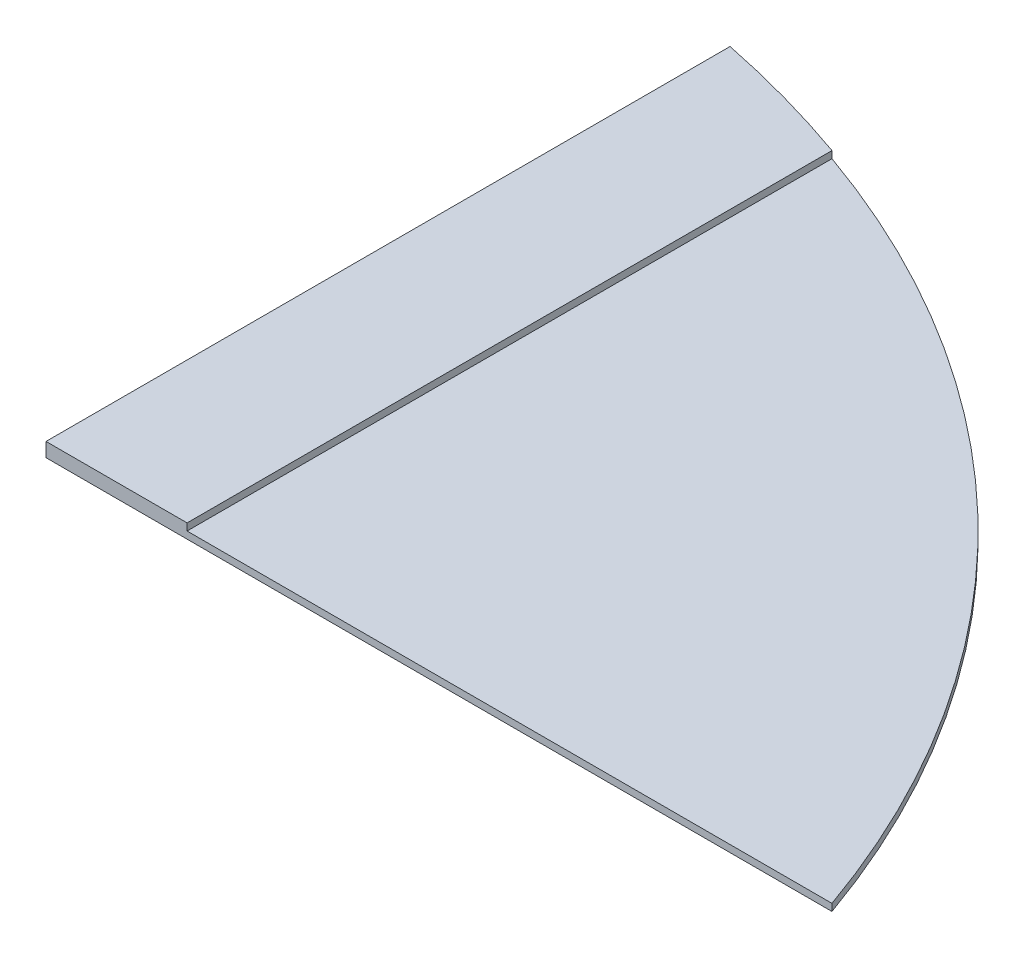
ISO-10303-21;
HEADER;
FILE_DESCRIPTION(('STEP AP214'),'2;1');
FILE_NAME('part.step','',(''),(''),'','','');
FILE_SCHEMA(('AUTOMOTIVE_DESIGN { 1 0 10303 214 1 1 1 1 }'));
ENDSEC;
DATA;
#1=APPLICATION_CONTEXT('core data for automotive mechanical design processes');
#2=APPLICATION_PROTOCOL_DEFINITION('international standard','automotive_design',2000,#1);
#3=PRODUCT_CONTEXT('',#1,'mechanical');
#4=PRODUCT('Part','Part','',(#3));
#5=PRODUCT_RELATED_PRODUCT_CATEGORY('part','',(#4));
#6=PRODUCT_DEFINITION_FORMATION('','',#4);
#7=PRODUCT_DEFINITION_CONTEXT('part definition',#1,'design');
#8=PRODUCT_DEFINITION('design','',#6,#7);
#9=PRODUCT_DEFINITION_SHAPE('','',#8);
#10=(LENGTH_UNIT() NAMED_UNIT(*) SI_UNIT(.MILLI.,.METRE.));
#11=(NAMED_UNIT(*) PLANE_ANGLE_UNIT() SI_UNIT($,.RADIAN.));
#12=(NAMED_UNIT(*) SI_UNIT($,.STERADIAN.) SOLID_ANGLE_UNIT());
#13=UNCERTAINTY_MEASURE_WITH_UNIT(LENGTH_MEASURE(1.E-05),#10,'distance_accuracy_value','');
#14=(GEOMETRIC_REPRESENTATION_CONTEXT(3) GLOBAL_UNCERTAINTY_ASSIGNED_CONTEXT((#13)) GLOBAL_UNIT_ASSIGNED_CONTEXT((#10,
#11,#12)) REPRESENTATION_CONTEXT('',''));
#15=CARTESIAN_POINT('',(0.,0.,0.));
#16=DIRECTION('',(0.,0.,1.));
#17=DIRECTION('',(1.,0.,0.));
#18=AXIS2_PLACEMENT_3D('',#15,#16,#17);
#19=CARTESIAN_POINT('',(0.,1.,0.));
#20=DIRECTION('',(0.,-1.,0.));
#21=DIRECTION('',(0.,0.,-1.));
#22=AXIS2_PLACEMENT_3D('',#19,#20,#21);
#23=CYLINDRICAL_SURFACE('',#22,150.);
#24=DIRECTION('',(0.,1.,0.));
#25=VECTOR('',#24,1.);
#26=CARTESIAN_POINT('',(141.421356237309,0.,-50.));
#27=LINE('',#26,#25);
#28=CARTESIAN_POINT('',(141.421356237309,0.,-50.));
#29=VERTEX_POINT('',#28);
#30=CARTESIAN_POINT('',(141.421356237309,1.,-50.));
#31=VERTEX_POINT('',#30);
#32=EDGE_CURVE('E82',#29,#31,#27,.T.);
#33=ORIENTED_EDGE('',*,*,#32,.F.);
#34=CARTESIAN_POINT('',(0.,0.,0.));
#35=DIRECTION('',(0.,1.,0.));
#36=DIRECTION('',(0.,0.,1.));
#37=AXIS2_PLACEMENT_3D('',#34,#35,#36);
#38=CIRCLE('',#37,150.);
#39=CARTESIAN_POINT('',(30.,0.,-146.969384566991));
#40=VERTEX_POINT('',#39);
#41=EDGE_CURVE('E60',#29,#40,#38,.T.);
#42=ORIENTED_EDGE('',*,*,#41,.T.);
#43=DIRECTION('',(0.,-1.,0.));
#44=VECTOR('',#43,1.);
#45=CARTESIAN_POINT('',(30.,1.,-146.969384566991));
#46=LINE('',#45,#44);
#47=CARTESIAN_POINT('',(30.,2.,-146.969384566991));
#48=VERTEX_POINT('',#47);
#49=EDGE_CURVE('E11',#48,#40,#46,.T.);
#50=ORIENTED_EDGE('',*,*,#49,.F.);
#51=CARTESIAN_POINT('',(-3.06976666308856E-11,2.,1.11272102643056E-10));
#52=DIRECTION('',(0.,1.,0.));
#53=DIRECTION('',(0.,0.,-1.));
#54=AXIS2_PLACEMENT_3D('',#51,#52,#53);
#55=CIRCLE('',#54,150.000000000115);
#56=CARTESIAN_POINT('',(50.,2.,-141.421356237309));
#57=VERTEX_POINT('',#56);
#58=EDGE_CURVE('E120',#57,#48,#55,.T.);
#59=ORIENTED_EDGE('',*,*,#58,.F.);
#60=DIRECTION('',(0.,-1.,0.));
#61=VECTOR('',#60,1.);
#62=CARTESIAN_POINT('',(50.,2.,-141.421356237309));
#63=LINE('',#62,#61);
#64=CARTESIAN_POINT('',(50.,1.,-141.421356237309));
#65=VERTEX_POINT('',#64);
#66=EDGE_CURVE('E87',#57,#65,#63,.T.);
#67=ORIENTED_EDGE('',*,*,#66,.T.);
#68=CARTESIAN_POINT('',(0.,1.,0.));
#69=DIRECTION('',(0.,1.,0.));
#70=DIRECTION('',(0.,0.,1.));
#71=AXIS2_PLACEMENT_3D('',#68,#69,#70);
#72=CIRCLE('',#71,150.);
#73=EDGE_CURVE('E39',#31,#65,#72,.T.);
#74=ORIENTED_EDGE('',*,*,#73,.F.);
#75=EDGE_LOOP('',(#33,#42,#50,#59,#67,#74));
#76=FACE_BOUND('',#75,.T.);
#77=ADVANCED_FACE('F35',(#76),#23,.T.);
#78=CARTESIAN_POINT('',(-40.3230520964317,1.,-88.4846922834953));
#79=DIRECTION('',(0.,1.,0.));
#80=DIRECTION('',(0.,0.,1.));
#81=AXIS2_PLACEMENT_3D('',#78,#79,#80);
#82=PLANE('',#81);
#83=DIRECTION('',(0.,0.,-1.));
#84=VECTOR('',#83,1.);
#85=CARTESIAN_POINT('',(50.,1.,-50.));
#86=LINE('',#85,#84);
#87=CARTESIAN_POINT('',(50.,1.,-50.));
#88=VERTEX_POINT('',#87);
#89=EDGE_CURVE('E91',#88,#65,#86,.T.);
#90=ORIENTED_EDGE('',*,*,#89,.F.);
#91=DIRECTION('',(1.,0.,0.));
#92=VECTOR('',#91,1.);
#93=CARTESIAN_POINT('',(-16.54692448681,1.,-50.));
#94=LINE('',#93,#92);
#95=EDGE_CURVE('E92',#88,#31,#94,.T.);
#96=ORIENTED_EDGE('',*,*,#95,.T.);
#97=ORIENTED_EDGE('',*,*,#73,.T.);
#98=EDGE_LOOP('',(#90,#96,#97));
#99=FACE_BOUND('',#98,.T.);
#100=ADVANCED_FACE('F128',(#99),#82,.T.);
#101=CARTESIAN_POINT('',(-40.3230520964317,0.,-88.4846922834953));
#102=DIRECTION('',(0.,1.,0.));
#103=DIRECTION('',(0.,0.,1.));
#104=AXIS2_PLACEMENT_3D('',#101,#102,#103);
#105=PLANE('',#104);
#106=ORIENTED_EDGE('',*,*,#41,.F.);
#107=DIRECTION('',(1.,0.,0.));
#108=VECTOR('',#107,1.);
#109=CARTESIAN_POINT('',(-40.3230520964317,0.,-50.));
#110=LINE('',#109,#108);
#111=CARTESIAN_POINT('',(30.,0.,-50.));
#112=VERTEX_POINT('',#111);
#113=EDGE_CURVE('E81',#112,#29,#110,.T.);
#114=ORIENTED_EDGE('',*,*,#113,.F.);
#115=DIRECTION('',(0.,0.,-1.));
#116=VECTOR('',#115,1.);
#117=CARTESIAN_POINT('',(30.,0.,-88.4846922834953));
#118=LINE('',#117,#116);
#119=EDGE_CURVE('E95',#112,#40,#118,.T.);
#120=ORIENTED_EDGE('',*,*,#119,.T.);
#121=EDGE_LOOP('',(#106,#114,#120));
#122=FACE_BOUND('',#121,.T.);
#123=ADVANCED_FACE('F94',(#122),#105,.F.);
#124=CARTESIAN_POINT('',(-40.3230520964317,1.,-50.));
#125=DIRECTION('',(0.,0.,-1.));
#126=DIRECTION('',(-1.,0.,0.));
#127=AXIS2_PLACEMENT_3D('',#124,#125,#126);
#128=PLANE('',#127);
#129=ORIENTED_EDGE('',*,*,#113,.T.);
#130=ORIENTED_EDGE('',*,*,#32,.T.);
#131=ORIENTED_EDGE('',*,*,#95,.F.);
#132=DIRECTION('',(0.,-1.,0.));
#133=VECTOR('',#132,1.);
#134=CARTESIAN_POINT('',(50.,2.,-50.));
#135=LINE('',#134,#133);
#136=CARTESIAN_POINT('',(50.,2.,-50.));
#137=VERTEX_POINT('',#136);
#138=EDGE_CURVE('E101',#137,#88,#135,.T.);
#139=ORIENTED_EDGE('',*,*,#138,.F.);
#140=DIRECTION('',(1.,0.,0.));
#141=VECTOR('',#140,1.);
#142=CARTESIAN_POINT('',(50.,2.,-50.));
#143=LINE('',#142,#141);
#144=CARTESIAN_POINT('',(30.,2.,-50.));
#145=VERTEX_POINT('',#144);
#146=EDGE_CURVE('E109',#145,#137,#143,.T.);
#147=ORIENTED_EDGE('',*,*,#146,.F.);
#148=DIRECTION('',(0.,-1.,0.));
#149=VECTOR('',#148,1.);
#150=CARTESIAN_POINT('',(30.,1.,-50.));
#151=LINE('',#150,#149);
#152=EDGE_CURVE('E45',#145,#112,#151,.T.);
#153=ORIENTED_EDGE('',*,*,#152,.T.);
#154=EDGE_LOOP('',(#129,#130,#131,#139,#147,#153));
#155=FACE_BOUND('',#154,.T.);
#156=ADVANCED_FACE('F37',(#155),#128,.F.);
#157=CARTESIAN_POINT('',(30.,1.,-88.4846922834953));
#158=DIRECTION('',(-1.,0.,0.));
#159=DIRECTION('',(0.,0.,1.));
#160=AXIS2_PLACEMENT_3D('',#157,#158,#159);
#161=PLANE('',#160);
#162=ORIENTED_EDGE('',*,*,#119,.F.);
#163=ORIENTED_EDGE('',*,*,#152,.F.);
#164=DIRECTION('',(0.,0.,1.));
#165=VECTOR('',#164,1.);
#166=CARTESIAN_POINT('',(30.,2.,-50.));
#167=LINE('',#166,#165);
#168=EDGE_CURVE('E116',#48,#145,#167,.T.);
#169=ORIENTED_EDGE('',*,*,#168,.F.);
#170=ORIENTED_EDGE('',*,*,#49,.T.);
#171=EDGE_LOOP('',(#162,#163,#169,#170));
#172=FACE_BOUND('',#171,.T.);
#173=ADVANCED_FACE('F133',(#172),#161,.T.);
#174=CARTESIAN_POINT('',(50.,2.,-50.));
#175=DIRECTION('',(-1.,0.,0.));
#176=DIRECTION('',(0.,0.,1.));
#177=AXIS2_PLACEMENT_3D('',#174,#175,#176);
#178=PLANE('',#177);
#179=ORIENTED_EDGE('',*,*,#89,.T.);
#180=ORIENTED_EDGE('',*,*,#66,.F.);
#181=DIRECTION('',(0.,0.,-1.));
#182=VECTOR('',#181,1.);
#183=CARTESIAN_POINT('',(50.,2.,-50.));
#184=LINE('',#183,#182);
#185=EDGE_CURVE('E105',#137,#57,#184,.T.);
#186=ORIENTED_EDGE('',*,*,#185,.F.);
#187=ORIENTED_EDGE('',*,*,#138,.T.);
#188=EDGE_LOOP('',(#179,#180,#186,#187));
#189=FACE_BOUND('',#188,.T.);
#190=ADVANCED_FACE('F130',(#189),#178,.F.);
#191=CARTESIAN_POINT('',(-3.06976666308856E-11,2.,1.11272102643056E-10));
#192=DIRECTION('',(0.,-1.,0.));
#193=DIRECTION('',(0.,0.,-1.));
#194=AXIS2_PLACEMENT_3D('',#191,#192,#193);
#195=PLANE('',#194);
#196=ORIENTED_EDGE('',*,*,#185,.T.);
#197=ORIENTED_EDGE('',*,*,#58,.T.);
#198=ORIENTED_EDGE('',*,*,#168,.T.);
#199=ORIENTED_EDGE('',*,*,#146,.T.);
#200=EDGE_LOOP('',(#196,#197,#198,#199));
#201=FACE_BOUND('',#200,.T.);
#202=ADVANCED_FACE('F131',(#201),#195,.F.);
#203=CLOSED_SHELL('',(#77,#100,#123,#156,#173,#190,#202));
#204=MANIFOLD_SOLID_BREP('B2',#203);
#205=ADVANCED_BREP_SHAPE_REPRESENTATION('',(#18,#204),#14);
#206=SHAPE_DEFINITION_REPRESENTATION(#9,#205);
ENDSEC;
END-ISO-10303-21;
